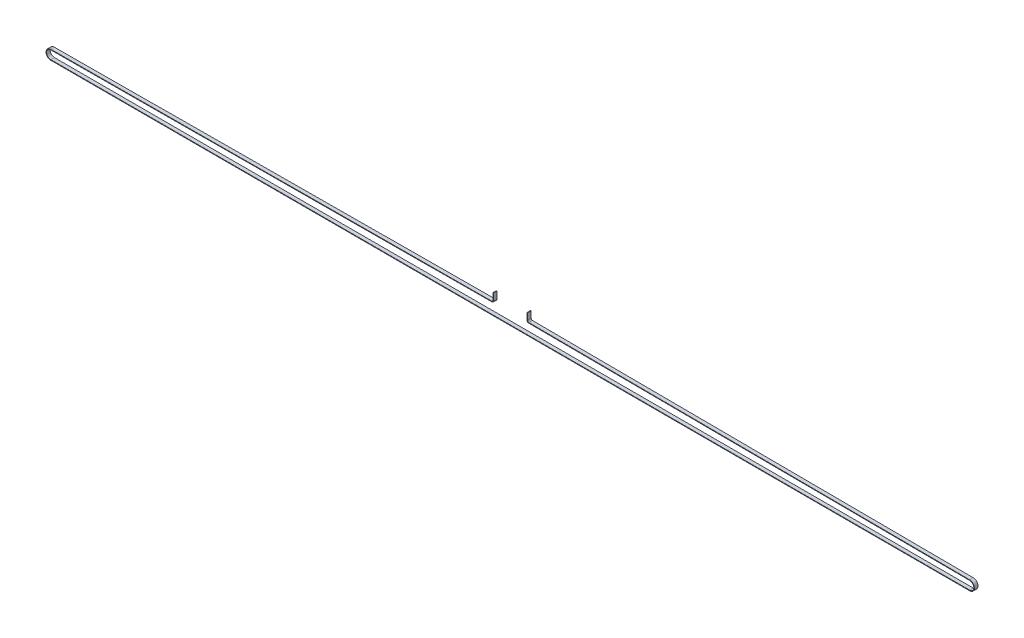
ISO-10303-21;
HEADER;
FILE_DESCRIPTION(('STEP AP214'),'2;1');
FILE_NAME('part.step','',(''),(''),'','','');
FILE_SCHEMA(('AUTOMOTIVE_DESIGN { 1 0 10303 214 1 1 1 1 }'));
ENDSEC;
DATA;
#1=APPLICATION_CONTEXT('core data for automotive mechanical design processes');
#2=APPLICATION_PROTOCOL_DEFINITION('international standard','automotive_design',2000,#1);
#3=PRODUCT_CONTEXT('',#1,'mechanical');
#4=PRODUCT('Part','Part','',(#3));
#5=PRODUCT_RELATED_PRODUCT_CATEGORY('part','',(#4));
#6=PRODUCT_DEFINITION_FORMATION('','',#4);
#7=PRODUCT_DEFINITION_CONTEXT('part definition',#1,'design');
#8=PRODUCT_DEFINITION('design','',#6,#7);
#9=PRODUCT_DEFINITION_SHAPE('','',#8);
#10=(LENGTH_UNIT() NAMED_UNIT(*) SI_UNIT(.MILLI.,.METRE.));
#11=(NAMED_UNIT(*) PLANE_ANGLE_UNIT() SI_UNIT($,.RADIAN.));
#12=(NAMED_UNIT(*) SI_UNIT($,.STERADIAN.) SOLID_ANGLE_UNIT());
#13=UNCERTAINTY_MEASURE_WITH_UNIT(LENGTH_MEASURE(1.E-05),#10,'distance_accuracy_value','');
#14=(GEOMETRIC_REPRESENTATION_CONTEXT(3) GLOBAL_UNCERTAINTY_ASSIGNED_CONTEXT((#13)) GLOBAL_UNIT_ASSIGNED_CONTEXT((#10,
#11,#12)) REPRESENTATION_CONTEXT('',''));
#15=CARTESIAN_POINT('',(0.,0.,0.));
#16=DIRECTION('',(0.,0.,1.));
#17=DIRECTION('',(1.,0.,0.));
#18=AXIS2_PLACEMENT_3D('',#15,#16,#17);
#19=CARTESIAN_POINT('',(-29.2,33.,6.56356693467296));
#20=DIRECTION('',(0.,1.,0.));
#21=DIRECTION('',(-1.,0.,0.));
#22=AXIS2_PLACEMENT_3D('',#19,#20,#21);
#23=PLANE('',#22);
#24=DIRECTION('',(0.,0.,1.));
#25=VECTOR('',#24,1.);
#26=CARTESIAN_POINT('',(-28.2,32.9999999999999,0.563566934672959));
#27=LINE('',#26,#25);
#28=CARTESIAN_POINT('',(-28.2,32.9999999999999,0.563566934672959));
#29=VERTEX_POINT('',#28);
#30=CARTESIAN_POINT('',(-28.2,32.9999999999999,6.56356693467296));
#31=VERTEX_POINT('',#30);
#32=EDGE_CURVE('E194',#29,#31,#27,.T.);
#33=ORIENTED_EDGE('',*,*,#32,.F.);
#34=DIRECTION('',(1.,0.,0.));
#35=VECTOR('',#34,1.);
#36=CARTESIAN_POINT('',(-29.2,33.,0.563566934672959));
#37=LINE('',#36,#35);
#38=CARTESIAN_POINT('',(-29.2,33.,0.563566934672959));
#39=VERTEX_POINT('',#38);
#40=EDGE_CURVE('E242',#39,#29,#37,.T.);
#41=ORIENTED_EDGE('',*,*,#40,.F.);
#42=DIRECTION('',(0.,0.,-1.));
#43=VECTOR('',#42,1.);
#44=CARTESIAN_POINT('',(-29.2,33.,6.56356693467296));
#45=LINE('',#44,#43);
#46=CARTESIAN_POINT('',(-29.2,33.,6.56356693467296));
#47=VERTEX_POINT('',#46);
#48=EDGE_CURVE('E206',#47,#39,#45,.T.);
#49=ORIENTED_EDGE('',*,*,#48,.F.);
#50=DIRECTION('',(1.,0.,0.));
#51=VECTOR('',#50,1.);
#52=CARTESIAN_POINT('',(-29.2,33.,6.56356693467296));
#53=LINE('',#52,#51);
#54=EDGE_CURVE('E182',#47,#31,#53,.T.);
#55=ORIENTED_EDGE('',*,*,#54,.T.);
#56=EDGE_LOOP('',(#33,#41,#49,#55));
#57=FACE_BOUND('',#56,.T.);
#58=ADVANCED_FACE('F39',(#57),#23,.T.);
#59=CARTESIAN_POINT('',(-29.2,20.,6.56356693467296));
#60=DIRECTION('',(-1.,0.,0.));
#61=DIRECTION('',(0.,0.,1.));
#62=AXIS2_PLACEMENT_3D('',#59,#60,#61);
#63=PLANE('',#62);
#64=DIRECTION('',(0.,1.,0.));
#65=VECTOR('',#64,1.);
#66=CARTESIAN_POINT('',(-29.2,20.,0.563566934672959));
#67=LINE('',#66,#65);
#68=CARTESIAN_POINT('',(-29.2,21.9892303321852,0.563566934672959));
#69=VERTEX_POINT('',#68);
#70=EDGE_CURVE('E237',#69,#39,#67,.T.);
#71=ORIENTED_EDGE('',*,*,#70,.F.);
#72=DIRECTION('',(0.,0.,-1.));
#73=VECTOR('',#72,1.);
#74=CARTESIAN_POINT('',(-29.2,21.9892303321852,6.56356693467296));
#75=LINE('',#74,#73);
#76=CARTESIAN_POINT('',(-29.2,21.9892303321852,6.56356693467296));
#77=VERTEX_POINT('',#76);
#78=EDGE_CURVE('E314',#69,#77,#75,.F.);
#79=ORIENTED_EDGE('',*,*,#78,.T.);
#80=DIRECTION('',(0.,1.,0.));
#81=VECTOR('',#80,1.);
#82=CARTESIAN_POINT('',(-29.2,20.,6.56356693467296));
#83=LINE('',#82,#81);
#84=EDGE_CURVE('E215',#77,#47,#83,.T.);
#85=ORIENTED_EDGE('',*,*,#84,.T.);
#86=ORIENTED_EDGE('',*,*,#48,.T.);
#87=EDGE_LOOP('',(#71,#79,#85,#86));
#88=FACE_BOUND('',#87,.T.);
#89=ADVANCED_FACE('F337',(#88),#63,.T.);
#90=CARTESIAN_POINT('',(-770.043194655313,15.9998833880096,6.56356693467296));
#91=DIRECTION('',(-0.00539933191416636,0.999985423501203,0.));
#92=DIRECTION('',(-0.999985423501203,-0.00539933191416636,0.));
#93=AXIS2_PLACEMENT_3D('',#90,#91,#92);
#94=PLANE('',#93);
#95=DIRECTION('',(0.999985423501203,0.00539933191416636,0.));
#96=VECTOR('',#95,1.);
#97=CARTESIAN_POINT('',(-770.043194655313,15.9998833880096,6.56356693467296));
#98=LINE('',#97,#96);
#99=CARTESIAN_POINT('',(-770.043194655313,15.9998833880095,6.56356693467296));
#100=VERTEX_POINT('',#99);
#101=CARTESIAN_POINT('',(-31.1892013361715,19.9892594851828,6.56356693467296));
#102=VERTEX_POINT('',#101);
#103=EDGE_CURVE('E233',#100,#102,#98,.T.);
#104=ORIENTED_EDGE('',*,*,#103,.T.);
#105=DIRECTION('',(0.,0.,-1.));
#106=VECTOR('',#105,1.);
#107=CARTESIAN_POINT('',(-31.1892013361717,19.9892594851828,0.563566934672959));
#108=LINE('',#107,#106);
#109=CARTESIAN_POINT('',(-31.1892013361715,19.9892594851828,0.563566934672959));
#110=VERTEX_POINT('',#109);
#111=EDGE_CURVE('E310',#102,#110,#108,.T.);
#112=ORIENTED_EDGE('',*,*,#111,.T.);
#113=DIRECTION('',(0.999985423501203,0.00539933191416636,0.));
#114=VECTOR('',#113,1.);
#115=CARTESIAN_POINT('',(-770.043194655313,15.9998833880096,0.563566934672959));
#116=LINE('',#115,#114);
#117=CARTESIAN_POINT('',(-770.043194655313,15.9998833880095,0.563566934672959));
#118=VERTEX_POINT('',#117);
#119=EDGE_CURVE('E264',#118,#110,#116,.T.);
#120=ORIENTED_EDGE('',*,*,#119,.F.);
#121=DIRECTION('',(0.,0.,-1.));
#122=VECTOR('',#121,1.);
#123=CARTESIAN_POINT('',(-770.043194655313,15.9998833880095,6.56356693467296));
#124=LINE('',#123,#122);
#125=EDGE_CURVE('E268',#100,#118,#124,.T.);
#126=ORIENTED_EDGE('',*,*,#125,.F.);
#127=EDGE_LOOP('',(#104,#112,#120,#126));
#128=FACE_BOUND('',#127,.T.);
#129=ADVANCED_FACE('F343',(#128),#94,.T.);
#130=CARTESIAN_POINT('',(-770.,8.,6.56356693467296));
#131=DIRECTION('',(0.,0.,-1.));
#132=DIRECTION('',(-1.,0.,0.));
#133=AXIS2_PLACEMENT_3D('',#130,#131,#132);
#134=CYLINDRICAL_SURFACE('',#133,7.99999999999986);
#135=CARTESIAN_POINT('',(-770.,8.,0.563566934672959));
#136=DIRECTION('',(0.,0.,-1.));
#137=DIRECTION('',(-1.,0.,0.));
#138=AXIS2_PLACEMENT_3D('',#135,#136,#137);
#139=CIRCLE('',#138,7.99999999999986);
#140=CARTESIAN_POINT('',(-770.,2.82738436431905E-13,0.563566934672959));
#141=VERTEX_POINT('',#140);
#142=EDGE_CURVE('E260',#141,#118,#139,.T.);
#143=ORIENTED_EDGE('',*,*,#142,.F.);
#144=DIRECTION('',(0.,0.,-1.));
#145=VECTOR('',#144,1.);
#146=CARTESIAN_POINT('',(-770.,2.82738436431905E-13,6.56356693467296));
#147=LINE('',#146,#145);
#148=CARTESIAN_POINT('',(-770.,2.82738436431905E-13,6.56356693467296));
#149=VERTEX_POINT('',#148);
#150=EDGE_CURVE('E272',#149,#141,#147,.T.);
#151=ORIENTED_EDGE('',*,*,#150,.F.);
#152=CARTESIAN_POINT('',(-770.,8.,6.56356693467296));
#153=DIRECTION('',(0.,0.,-1.));
#154=DIRECTION('',(-1.,0.,0.));
#155=AXIS2_PLACEMENT_3D('',#152,#153,#154);
#156=CIRCLE('',#155,7.99999999999986);
#157=EDGE_CURVE('E229',#149,#100,#156,.T.);
#158=ORIENTED_EDGE('',*,*,#157,.T.);
#159=ORIENTED_EDGE('',*,*,#125,.T.);
#160=EDGE_LOOP('',(#143,#151,#158,#159));
#161=FACE_BOUND('',#160,.T.);
#162=ADVANCED_FACE('F346',(#161),#134,.T.);
#163=CARTESIAN_POINT('',(770.,0.,6.56356693467296));
#164=DIRECTION('',(0.,-1.,0.));
#165=DIRECTION('',(1.,0.,0.));
#166=AXIS2_PLACEMENT_3D('',#163,#164,#165);
#167=PLANE('',#166);
#168=DIRECTION('',(-1.,0.,0.));
#169=VECTOR('',#168,1.);
#170=CARTESIAN_POINT('',(770.,0.,0.563566934672959));
#171=LINE('',#170,#169);
#172=CARTESIAN_POINT('',(770.,0.,0.563566934672959));
#173=VERTEX_POINT('',#172);
#174=EDGE_CURVE('E256',#173,#141,#171,.T.);
#175=ORIENTED_EDGE('',*,*,#174,.F.);
#176=DIRECTION('',(0.,0.,-1.));
#177=VECTOR('',#176,1.);
#178=CARTESIAN_POINT('',(770.,0.,6.56356693467296));
#179=LINE('',#178,#177);
#180=CARTESIAN_POINT('',(770.,0.,6.56356693467296));
#181=VERTEX_POINT('',#180);
#182=EDGE_CURVE('E275',#181,#173,#179,.T.);
#183=ORIENTED_EDGE('',*,*,#182,.F.);
#184=DIRECTION('',(-1.,0.,0.));
#185=VECTOR('',#184,1.);
#186=CARTESIAN_POINT('',(770.,0.,6.56356693467296));
#187=LINE('',#186,#185);
#188=EDGE_CURVE('E225',#181,#149,#187,.T.);
#189=ORIENTED_EDGE('',*,*,#188,.T.);
#190=ORIENTED_EDGE('',*,*,#150,.T.);
#191=EDGE_LOOP('',(#175,#183,#189,#190));
#192=FACE_BOUND('',#191,.T.);
#193=ADVANCED_FACE('F351',(#192),#167,.T.);
#194=CARTESIAN_POINT('',(770.,8.,6.56356693467296));
#195=DIRECTION('',(0.,0.,-1.));
#196=DIRECTION('',(-1.,0.,0.));
#197=AXIS2_PLACEMENT_3D('',#194,#195,#196);
#198=CYLINDRICAL_SURFACE('',#197,8.);
#199=CARTESIAN_POINT('',(770.,8.,0.563566934672959));
#200=DIRECTION('',(0.,0.,-1.));
#201=DIRECTION('',(-1.,0.,0.));
#202=AXIS2_PLACEMENT_3D('',#199,#200,#201);
#203=CIRCLE('',#202,8.);
#204=CARTESIAN_POINT('',(770.043194655313,15.9998833880096,0.563566934672959));
#205=VERTEX_POINT('',#204);
#206=EDGE_CURVE('E252',#205,#173,#203,.T.);
#207=ORIENTED_EDGE('',*,*,#206,.F.);
#208=DIRECTION('',(0.,0.,-1.));
#209=VECTOR('',#208,1.);
#210=CARTESIAN_POINT('',(770.043194655313,15.9998833880096,6.56356693467296));
#211=LINE('',#210,#209);
#212=CARTESIAN_POINT('',(770.043194655313,15.9998833880096,6.56356693467296));
#213=VERTEX_POINT('',#212);
#214=EDGE_CURVE('E278',#213,#205,#211,.T.);
#215=ORIENTED_EDGE('',*,*,#214,.F.);
#216=CARTESIAN_POINT('',(770.,8.,6.56356693467296));
#217=DIRECTION('',(0.,0.,-1.));
#218=DIRECTION('',(-1.,0.,0.));
#219=AXIS2_PLACEMENT_3D('',#216,#217,#218);
#220=CIRCLE('',#219,8.);
#221=EDGE_CURVE('E221',#213,#181,#220,.T.);
#222=ORIENTED_EDGE('',*,*,#221,.T.);
#223=ORIENTED_EDGE('',*,*,#182,.T.);
#224=EDGE_LOOP('',(#207,#215,#222,#223));
#225=FACE_BOUND('',#224,.T.);
#226=ADVANCED_FACE('F354',(#225),#198,.T.);
#227=CARTESIAN_POINT('',(29.2,20.,6.56356693467296));
#228=DIRECTION('',(0.00539933191416636,0.999985423501203,0.));
#229=DIRECTION('',(-0.999985423501203,0.00539933191416636,0.));
#230=AXIS2_PLACEMENT_3D('',#227,#228,#229);
#231=PLANE('',#230);
#232=DIRECTION('',(0.999985423501203,-0.00539933191416635,0.));
#233=VECTOR('',#232,1.);
#234=CARTESIAN_POINT('',(29.2,20.,0.563566934672959));
#235=LINE('',#234,#233);
#236=CARTESIAN_POINT('',(31.1892013361717,19.9892594851828,0.563566934672959));
#237=VERTEX_POINT('',#236);
#238=EDGE_CURVE('E249',#237,#205,#235,.T.);
#239=ORIENTED_EDGE('',*,*,#238,.F.);
#240=DIRECTION('',(0.,0.,-1.));
#241=VECTOR('',#240,1.);
#242=CARTESIAN_POINT('',(31.1892013361717,19.9892594851828,6.56356693467296));
#243=LINE('',#242,#241);
#244=CARTESIAN_POINT('',(31.1892013361717,19.9892594851828,6.56356693467296));
#245=VERTEX_POINT('',#244);
#246=EDGE_CURVE('E63',#237,#245,#243,.F.);
#247=ORIENTED_EDGE('',*,*,#246,.T.);
#248=DIRECTION('',(0.999985423501203,-0.00539933191416635,0.));
#249=VECTOR('',#248,1.);
#250=CARTESIAN_POINT('',(29.2,20.,6.56356693467296));
#251=LINE('',#250,#249);
#252=EDGE_CURVE('E213',#245,#213,#251,.T.);
#253=ORIENTED_EDGE('',*,*,#252,.T.);
#254=ORIENTED_EDGE('',*,*,#214,.T.);
#255=EDGE_LOOP('',(#239,#247,#253,#254));
#256=FACE_BOUND('',#255,.T.);
#257=ADVANCED_FACE('F479',(#256),#231,.T.);
#258=CARTESIAN_POINT('',(29.2,33.,6.56356693467296));
#259=DIRECTION('',(1.,0.,0.));
#260=DIRECTION('',(0.,1.,0.));
#261=AXIS2_PLACEMENT_3D('',#258,#259,#260);
#262=PLANE('',#261);
#263=DIRECTION('',(0.,-1.,0.));
#264=VECTOR('',#263,1.);
#265=CARTESIAN_POINT('',(29.2,33.,6.56356693467296));
#266=LINE('',#265,#264);
#267=CARTESIAN_POINT('',(29.2,33.,6.56356693467296));
#268=VERTEX_POINT('',#267);
#269=CARTESIAN_POINT('',(29.2,21.9892303321852,6.56356693467296));
#270=VERTEX_POINT('',#269);
#271=EDGE_CURVE('E208',#268,#270,#266,.T.);
#272=ORIENTED_EDGE('',*,*,#271,.T.);
#273=DIRECTION('',(0.,0.,-1.));
#274=VECTOR('',#273,1.);
#275=CARTESIAN_POINT('',(29.2,21.9892303321852,0.563566934672959));
#276=LINE('',#275,#274);
#277=CARTESIAN_POINT('',(29.2,21.9892303321852,0.563566934672959));
#278=VERTEX_POINT('',#277);
#279=EDGE_CURVE('E304',#270,#278,#276,.T.);
#280=ORIENTED_EDGE('',*,*,#279,.T.);
#281=DIRECTION('',(0.,-1.,0.));
#282=VECTOR('',#281,1.);
#283=CARTESIAN_POINT('',(29.2,33.,0.563566934672959));
#284=LINE('',#283,#282);
#285=CARTESIAN_POINT('',(29.2,33.,0.563566934672959));
#286=VERTEX_POINT('',#285);
#287=EDGE_CURVE('E245',#286,#278,#284,.T.);
#288=ORIENTED_EDGE('',*,*,#287,.F.);
#289=DIRECTION('',(0.,0.,-1.));
#290=VECTOR('',#289,1.);
#291=CARTESIAN_POINT('',(29.2,33.,6.56356693467296));
#292=LINE('',#291,#290);
#293=EDGE_CURVE('E282',#268,#286,#292,.T.);
#294=ORIENTED_EDGE('',*,*,#293,.F.);
#295=EDGE_LOOP('',(#272,#280,#288,#294));
#296=FACE_BOUND('',#295,.T.);
#297=ADVANCED_FACE('F361',(#296),#262,.T.);
#298=DIRECTION('',(0.,0.,-1.));
#299=VECTOR('',#298,1.);
#300=CARTESIAN_POINT('',(28.2,33.0000000000001,6.56356693467296));
#301=LINE('',#300,#299);
#302=CARTESIAN_POINT('',(28.2,33.0000000000001,6.56356693467296));
#303=VERTEX_POINT('',#302);
#304=CARTESIAN_POINT('',(28.2,33.0000000000001,0.563566934672959));
#305=VERTEX_POINT('',#304);
#306=EDGE_CURVE('E202',#303,#305,#301,.T.);
#307=ORIENTED_EDGE('',*,*,#306,.F.);
#308=EDGE_CURVE('E209',#303,#268,#53,.T.);
#309=ORIENTED_EDGE('',*,*,#308,.T.);
#310=ORIENTED_EDGE('',*,*,#293,.T.);
#311=EDGE_CURVE('E240',#305,#286,#37,.T.);
#312=ORIENTED_EDGE('',*,*,#311,.F.);
#313=EDGE_LOOP('',(#307,#309,#310,#312));
#314=FACE_BOUND('',#313,.T.);
#315=ADVANCED_FACE('F370',(#314),#23,.T.);
#316=CARTESIAN_POINT('',(770.,8.,6.56356693467296));
#317=DIRECTION('',(0.,0.,-1.));
#318=DIRECTION('',(-1.,0.,0.));
#319=AXIS2_PLACEMENT_3D('',#316,#317,#318);
#320=PLANE('',#319);
#321=DIRECTION('',(0.,1.,0.));
#322=VECTOR('',#321,1.);
#323=CARTESIAN_POINT('',(-28.2,19.0053848339074,6.56356693467296));
#324=LINE('',#323,#322);
#325=CARTESIAN_POINT('',(-28.2,20.9946151660926,6.56356693467296));
#326=VERTEX_POINT('',#325);
#327=EDGE_CURVE('E177',#326,#31,#324,.T.);
#328=ORIENTED_EDGE('',*,*,#327,.T.);
#329=ORIENTED_EDGE('',*,*,#54,.F.);
#330=ORIENTED_EDGE('',*,*,#84,.F.);
#331=CARTESIAN_POINT('',(-31.2,21.9892303321852,6.56356693467296));
#332=DIRECTION('',(0.,0.,-1.));
#333=DIRECTION('',(-1.,0.,0.));
#334=AXIS2_PLACEMENT_3D('',#331,#332,#333);
#335=CIRCLE('',#334,2.);
#336=EDGE_CURVE('E11',#77,#102,#335,.T.);
#337=ORIENTED_EDGE('',*,*,#336,.T.);
#338=ORIENTED_EDGE('',*,*,#103,.F.);
#339=ORIENTED_EDGE('',*,*,#157,.F.);
#340=ORIENTED_EDGE('',*,*,#188,.F.);
#341=ORIENTED_EDGE('',*,*,#221,.F.);
#342=ORIENTED_EDGE('',*,*,#252,.F.);
#343=CARTESIAN_POINT('',(31.2,21.9892303321852,6.56356693467296));
#344=DIRECTION('',(0.,0.,-1.));
#345=DIRECTION('',(-1.,0.,0.));
#346=AXIS2_PLACEMENT_3D('',#343,#344,#345);
#347=CIRCLE('',#346,2.);
#348=EDGE_CURVE('E55',#245,#270,#347,.T.);
#349=ORIENTED_EDGE('',*,*,#348,.T.);
#350=ORIENTED_EDGE('',*,*,#271,.F.);
#351=ORIENTED_EDGE('',*,*,#308,.F.);
#352=DIRECTION('',(0.,-1.,0.));
#353=VECTOR('',#352,1.);
#354=CARTESIAN_POINT('',(28.2,32.,6.56356693467296));
#355=LINE('',#354,#353);
#356=CARTESIAN_POINT('',(28.2,20.9946151660926,6.56356693467296));
#357=VERTEX_POINT('',#356);
#358=EDGE_CURVE('E190',#303,#357,#355,.T.);
#359=ORIENTED_EDGE('',*,*,#358,.T.);
#360=CARTESIAN_POINT('',(30.2,20.9946151660926,6.56356693467296));
#361=DIRECTION('',(0.,0.,-1.));
#362=DIRECTION('',(-1.,0.,0.));
#363=AXIS2_PLACEMENT_3D('',#360,#361,#362);
#364=CIRCLE('',#363,2.);
#365=CARTESIAN_POINT('',(30.1892013361717,18.9946443190902,6.56356693467296));
#366=VERTEX_POINT('',#365);
#367=EDGE_CURVE('E299',#357,#366,#364,.F.);
#368=ORIENTED_EDGE('',*,*,#367,.T.);
#369=DIRECTION('',(0.999985423501203,-0.00539933191416636,0.));
#370=VECTOR('',#369,1.);
#371=CARTESIAN_POINT('',(28.2,19.0053848339074,6.56356693467296));
#372=LINE('',#371,#370);
#373=CARTESIAN_POINT('',(770.037795323399,14.9998979645084,6.56356693467296));
#374=VERTEX_POINT('',#373);
#375=EDGE_CURVE('E377',#366,#374,#372,.T.);
#376=ORIENTED_EDGE('',*,*,#375,.T.);
#377=CARTESIAN_POINT('',(770.,8.,6.56356693467296));
#378=DIRECTION('',(0.,0.,-1.));
#379=DIRECTION('',(-1.,0.,0.));
#380=AXIS2_PLACEMENT_3D('',#377,#378,#379);
#381=CIRCLE('',#380,7.);
#382=CARTESIAN_POINT('',(770.,1.,6.56356693467296));
#383=VERTEX_POINT('',#382);
#384=EDGE_CURVE('E427',#374,#383,#381,.T.);
#385=ORIENTED_EDGE('',*,*,#384,.T.);
#386=DIRECTION('',(-1.,0.,0.));
#387=VECTOR('',#386,1.);
#388=CARTESIAN_POINT('',(770.,1.,6.56356693467296));
#389=LINE('',#388,#387);
#390=CARTESIAN_POINT('',(-770.,1.00000000000028,6.56356693467296));
#391=VERTEX_POINT('',#390);
#392=EDGE_CURVE('E422',#383,#391,#389,.T.);
#393=ORIENTED_EDGE('',*,*,#392,.T.);
#394=CARTESIAN_POINT('',(-770.,8.,6.56356693467296));
#395=DIRECTION('',(0.,0.,-1.));
#396=DIRECTION('',(-1.,0.,0.));
#397=AXIS2_PLACEMENT_3D('',#394,#395,#396);
#398=CIRCLE('',#397,6.99999999999975);
#399=CARTESIAN_POINT('',(-770.037795323399,14.9998979645082,6.56356693467296));
#400=VERTEX_POINT('',#399);
#401=EDGE_CURVE('E417',#391,#400,#398,.T.);
#402=ORIENTED_EDGE('',*,*,#401,.T.);
#403=DIRECTION('',(0.999985423501203,0.00539933191416664,0.));
#404=VECTOR('',#403,1.);
#405=CARTESIAN_POINT('',(-770.037795323399,14.9998979645082,6.56356693467296));
#406=LINE('',#405,#404);
#407=CARTESIAN_POINT('',(-30.1892013361715,18.9946443190902,6.56356693467296));
#408=VERTEX_POINT('',#407);
#409=EDGE_CURVE('E191',#400,#408,#406,.T.);
#410=ORIENTED_EDGE('',*,*,#409,.T.);
#411=CARTESIAN_POINT('',(-30.2,20.9946151660926,6.56356693467296));
#412=DIRECTION('',(0.,0.,-1.));
#413=DIRECTION('',(-1.,0.,0.));
#414=AXIS2_PLACEMENT_3D('',#411,#412,#413);
#415=CIRCLE('',#414,2.);
#416=EDGE_CURVE('E185',#408,#326,#415,.F.);
#417=ORIENTED_EDGE('',*,*,#416,.T.);
#418=EDGE_LOOP('',(#328,#329,#330,#337,#338,#339,#340,#341,#342,#349,#350,#351,#359,#368,#376,
#385,#393,#402,#410,#417));
#419=FACE_BOUND('',#418,.T.);
#420=ADVANCED_FACE('F179',(#419),#320,.F.);
#421=CARTESIAN_POINT('',(770.,8.,0.563566934672959));
#422=DIRECTION('',(0.,0.,-1.));
#423=DIRECTION('',(-1.,0.,0.));
#424=AXIS2_PLACEMENT_3D('',#421,#422,#423);
#425=PLANE('',#424);
#426=ORIENTED_EDGE('',*,*,#40,.T.);
#427=DIRECTION('',(0.,1.,0.));
#428=VECTOR('',#427,1.);
#429=CARTESIAN_POINT('',(-28.2,19.0053848339074,0.563566934672959));
#430=LINE('',#429,#428);
#431=CARTESIAN_POINT('',(-28.2,20.9946151660926,0.563566934672959));
#432=VERTEX_POINT('',#431);
#433=EDGE_CURVE('E197',#432,#29,#430,.T.);
#434=ORIENTED_EDGE('',*,*,#433,.F.);
#435=CARTESIAN_POINT('',(-30.2,20.9946151660926,0.563566934672959));
#436=DIRECTION('',(0.,0.,-1.));
#437=DIRECTION('',(-1.,0.,0.));
#438=AXIS2_PLACEMENT_3D('',#435,#436,#437);
#439=CIRCLE('',#438,2.);
#440=CARTESIAN_POINT('',(-30.1892013361715,18.9946443190902,0.563566934672959));
#441=VERTEX_POINT('',#440);
#442=EDGE_CURVE('E293',#432,#441,#439,.T.);
#443=ORIENTED_EDGE('',*,*,#442,.T.);
#444=DIRECTION('',(0.999985423501203,0.00539933191416664,0.));
#445=VECTOR('',#444,1.);
#446=CARTESIAN_POINT('',(-770.037795323399,14.9998979645082,0.563566934672959));
#447=LINE('',#446,#445);
#448=CARTESIAN_POINT('',(-770.037795323399,14.9998979645082,0.563566934672959));
#449=VERTEX_POINT('',#448);
#450=EDGE_CURVE('E431',#449,#441,#447,.T.);
#451=ORIENTED_EDGE('',*,*,#450,.F.);
#452=CARTESIAN_POINT('',(-770.,8.,0.563566934672959));
#453=DIRECTION('',(0.,0.,-1.));
#454=DIRECTION('',(-1.,0.,0.));
#455=AXIS2_PLACEMENT_3D('',#452,#453,#454);
#456=CIRCLE('',#455,6.99999999999975);
#457=CARTESIAN_POINT('',(-770.,1.00000000000028,0.563566934672959));
#458=VERTEX_POINT('',#457);
#459=EDGE_CURVE('E404',#458,#449,#456,.T.);
#460=ORIENTED_EDGE('',*,*,#459,.F.);
#461=DIRECTION('',(-1.,0.,0.));
#462=VECTOR('',#461,1.);
#463=CARTESIAN_POINT('',(770.,1.,0.563566934672959));
#464=LINE('',#463,#462);
#465=CARTESIAN_POINT('',(770.,1.,0.563566934672959));
#466=VERTEX_POINT('',#465);
#467=EDGE_CURVE('E396',#466,#458,#464,.T.);
#468=ORIENTED_EDGE('',*,*,#467,.F.);
#469=CARTESIAN_POINT('',(770.,8.,0.563566934672959));
#470=DIRECTION('',(0.,0.,-1.));
#471=DIRECTION('',(-1.,0.,0.));
#472=AXIS2_PLACEMENT_3D('',#469,#470,#471);
#473=CIRCLE('',#472,7.);
#474=CARTESIAN_POINT('',(770.037795323399,14.9998979645084,0.563566934672959));
#475=VERTEX_POINT('',#474);
#476=EDGE_CURVE('E391',#475,#466,#473,.T.);
#477=ORIENTED_EDGE('',*,*,#476,.F.);
#478=DIRECTION('',(0.999985423501203,-0.00539933191416636,0.));
#479=VECTOR('',#478,1.);
#480=CARTESIAN_POINT('',(28.2,19.0053848339074,0.563566934672959));
#481=LINE('',#480,#479);
#482=CARTESIAN_POINT('',(30.1892013361717,18.9946443190902,0.563566934672959));
#483=VERTEX_POINT('',#482);
#484=EDGE_CURVE('E386',#483,#475,#481,.T.);
#485=ORIENTED_EDGE('',*,*,#484,.F.);
#486=CARTESIAN_POINT('',(30.2,20.9946151660926,0.563566934672959));
#487=DIRECTION('',(0.,0.,-1.));
#488=DIRECTION('',(-1.,0.,0.));
#489=AXIS2_PLACEMENT_3D('',#486,#487,#488);
#490=CIRCLE('',#489,2.);
#491=CARTESIAN_POINT('',(28.2,20.9946151660926,0.563566934672959));
#492=VERTEX_POINT('',#491);
#493=EDGE_CURVE('E290',#483,#492,#490,.T.);
#494=ORIENTED_EDGE('',*,*,#493,.T.);
#495=DIRECTION('',(0.,-1.,0.));
#496=VECTOR('',#495,1.);
#497=CARTESIAN_POINT('',(28.2,32.,0.563566934672959));
#498=LINE('',#497,#496);
#499=EDGE_CURVE('E365',#305,#492,#498,.T.);
#500=ORIENTED_EDGE('',*,*,#499,.F.);
#501=ORIENTED_EDGE('',*,*,#311,.T.);
#502=ORIENTED_EDGE('',*,*,#287,.T.);
#503=CARTESIAN_POINT('',(31.2,21.9892303321852,0.563566934672959));
#504=DIRECTION('',(0.,0.,-1.));
#505=DIRECTION('',(-1.,0.,0.));
#506=AXIS2_PLACEMENT_3D('',#503,#504,#505);
#507=CIRCLE('',#506,2.);
#508=EDGE_CURVE('E324',#278,#237,#507,.F.);
#509=ORIENTED_EDGE('',*,*,#508,.T.);
#510=ORIENTED_EDGE('',*,*,#238,.T.);
#511=ORIENTED_EDGE('',*,*,#206,.T.);
#512=ORIENTED_EDGE('',*,*,#174,.T.);
#513=ORIENTED_EDGE('',*,*,#142,.T.);
#514=ORIENTED_EDGE('',*,*,#119,.T.);
#515=CARTESIAN_POINT('',(-31.2,21.9892303321852,0.563566934672959));
#516=DIRECTION('',(0.,0.,-1.));
#517=DIRECTION('',(-1.,0.,0.));
#518=AXIS2_PLACEMENT_3D('',#515,#516,#517);
#519=CIRCLE('',#518,2.);
#520=EDGE_CURVE('E48',#110,#69,#519,.F.);
#521=ORIENTED_EDGE('',*,*,#520,.T.);
#522=ORIENTED_EDGE('',*,*,#70,.T.);
#523=EDGE_LOOP('',(#426,#434,#443,#451,#460,#468,#477,#485,#494,#500,#501,#502,#509,#510,#511,
#512,#513,#514,#521,#522));
#524=FACE_BOUND('',#523,.T.);
#525=ADVANCED_FACE('F331',(#524),#425,.T.);
#526=CARTESIAN_POINT('',(-770.037795323399,14.9998979645082,6.56356693467296));
#527=DIRECTION('',(-0.00539933191416664,0.999985423501203,0.));
#528=DIRECTION('',(-0.999985423501203,-0.00539933191416664,0.));
#529=AXIS2_PLACEMENT_3D('',#526,#527,#528);
#530=PLANE('',#529);
#531=ORIENTED_EDGE('',*,*,#450,.T.);
#532=DIRECTION('',(0.,0.,-1.));
#533=VECTOR('',#532,1.);
#534=CARTESIAN_POINT('',(-30.1892013361718,18.9946443190902,6.56356693467296));
#535=LINE('',#534,#533);
#536=EDGE_CURVE('E296',#441,#408,#535,.F.);
#537=ORIENTED_EDGE('',*,*,#536,.T.);
#538=ORIENTED_EDGE('',*,*,#409,.F.);
#539=DIRECTION('',(0.,0.,-1.));
#540=VECTOR('',#539,1.);
#541=CARTESIAN_POINT('',(-770.037795323399,14.9998979645082,6.56356693467296));
#542=LINE('',#541,#540);
#543=EDGE_CURVE('E241',#400,#449,#542,.T.);
#544=ORIENTED_EDGE('',*,*,#543,.T.);
#545=EDGE_LOOP('',(#531,#537,#538,#544));
#546=FACE_BOUND('',#545,.T.);
#547=ADVANCED_FACE('F453',(#546),#530,.F.);
#548=CARTESIAN_POINT('',(-770.,8.,6.56356693467296));
#549=DIRECTION('',(0.,0.,-1.));
#550=DIRECTION('',(-1.,0.,0.));
#551=AXIS2_PLACEMENT_3D('',#548,#549,#550);
#552=CYLINDRICAL_SURFACE('',#551,6.99999999999975);
#553=ORIENTED_EDGE('',*,*,#459,.T.);
#554=ORIENTED_EDGE('',*,*,#543,.F.);
#555=ORIENTED_EDGE('',*,*,#401,.F.);
#556=DIRECTION('',(0.,0.,-1.));
#557=VECTOR('',#556,1.);
#558=CARTESIAN_POINT('',(-770.,1.00000000000028,6.56356693467296));
#559=LINE('',#558,#557);
#560=EDGE_CURVE('E410',#391,#458,#559,.T.);
#561=ORIENTED_EDGE('',*,*,#560,.T.);
#562=EDGE_LOOP('',(#553,#554,#555,#561));
#563=FACE_BOUND('',#562,.T.);
#564=ADVANCED_FACE('F449',(#563),#552,.F.);
#565=CARTESIAN_POINT('',(770.,1.,6.56356693467296));
#566=DIRECTION('',(0.,-1.,0.));
#567=DIRECTION('',(1.,0.,0.));
#568=AXIS2_PLACEMENT_3D('',#565,#566,#567);
#569=PLANE('',#568);
#570=ORIENTED_EDGE('',*,*,#467,.T.);
#571=ORIENTED_EDGE('',*,*,#560,.F.);
#572=ORIENTED_EDGE('',*,*,#392,.F.);
#573=DIRECTION('',(0.,0.,-1.));
#574=VECTOR('',#573,1.);
#575=CARTESIAN_POINT('',(770.,1.,6.56356693467296));
#576=LINE('',#575,#574);
#577=EDGE_CURVE('E413',#383,#466,#576,.T.);
#578=ORIENTED_EDGE('',*,*,#577,.T.);
#579=EDGE_LOOP('',(#570,#571,#572,#578));
#580=FACE_BOUND('',#579,.T.);
#581=ADVANCED_FACE('F446',(#580),#569,.F.);
#582=CARTESIAN_POINT('',(770.,8.,6.56356693467296));
#583=DIRECTION('',(0.,0.,-1.));
#584=DIRECTION('',(-1.,0.,0.));
#585=AXIS2_PLACEMENT_3D('',#582,#583,#584);
#586=CYLINDRICAL_SURFACE('',#585,7.);
#587=ORIENTED_EDGE('',*,*,#476,.T.);
#588=ORIENTED_EDGE('',*,*,#577,.F.);
#589=ORIENTED_EDGE('',*,*,#384,.F.);
#590=DIRECTION('',(0.,0.,-1.));
#591=VECTOR('',#590,1.);
#592=CARTESIAN_POINT('',(770.037795323399,14.9998979645084,6.56356693467296));
#593=LINE('',#592,#591);
#594=EDGE_CURVE('E415',#374,#475,#593,.T.);
#595=ORIENTED_EDGE('',*,*,#594,.T.);
#596=EDGE_LOOP('',(#587,#588,#589,#595));
#597=FACE_BOUND('',#596,.T.);
#598=ADVANCED_FACE('F444',(#597),#586,.F.);
#599=CARTESIAN_POINT('',(28.2,19.0053848339074,6.56356693467296));
#600=DIRECTION('',(0.00539933191416635,0.999985423501203,0.));
#601=DIRECTION('',(-0.999985423501203,0.00539933191416635,0.));
#602=AXIS2_PLACEMENT_3D('',#599,#600,#601);
#603=PLANE('',#602);
#604=ORIENTED_EDGE('',*,*,#375,.F.);
#605=DIRECTION('',(0.,0.,-1.));
#606=VECTOR('',#605,1.);
#607=CARTESIAN_POINT('',(30.1892013361717,18.9946443190902,6.56356693467296));
#608=LINE('',#607,#606);
#609=EDGE_CURVE('E317',#366,#483,#608,.T.);
#610=ORIENTED_EDGE('',*,*,#609,.T.);
#611=ORIENTED_EDGE('',*,*,#484,.T.);
#612=ORIENTED_EDGE('',*,*,#594,.F.);
#613=EDGE_LOOP('',(#604,#610,#611,#612));
#614=FACE_BOUND('',#613,.T.);
#615=ADVANCED_FACE('F384',(#614),#603,.F.);
#616=CARTESIAN_POINT('',(28.2,32.,6.56356693467296));
#617=DIRECTION('',(1.,0.,0.));
#618=DIRECTION('',(0.,1.,0.));
#619=AXIS2_PLACEMENT_3D('',#616,#617,#618);
#620=PLANE('',#619);
#621=ORIENTED_EDGE('',*,*,#499,.T.);
#622=DIRECTION('',(0.,0.,-1.));
#623=VECTOR('',#622,1.);
#624=CARTESIAN_POINT('',(28.2,20.9946151660926,6.56356693467296));
#625=LINE('',#624,#623);
#626=EDGE_CURVE('E321',#492,#357,#625,.F.);
#627=ORIENTED_EDGE('',*,*,#626,.T.);
#628=ORIENTED_EDGE('',*,*,#358,.F.);
#629=ORIENTED_EDGE('',*,*,#306,.T.);
#630=EDGE_LOOP('',(#621,#627,#628,#629));
#631=FACE_BOUND('',#630,.T.);
#632=ADVANCED_FACE('F464',(#631),#620,.F.);
#633=CARTESIAN_POINT('',(-28.2,19.0053848339074,6.56356693467296));
#634=DIRECTION('',(-1.,0.,0.));
#635=DIRECTION('',(0.,0.,1.));
#636=AXIS2_PLACEMENT_3D('',#633,#634,#635);
#637=PLANE('',#636);
#638=ORIENTED_EDGE('',*,*,#327,.F.);
#639=DIRECTION('',(0.,0.,-1.));
#640=VECTOR('',#639,1.);
#641=CARTESIAN_POINT('',(-28.2,20.9946151660926,6.56356693467296));
#642=LINE('',#641,#640);
#643=EDGE_CURVE('E271',#326,#432,#642,.T.);
#644=ORIENTED_EDGE('',*,*,#643,.T.);
#645=ORIENTED_EDGE('',*,*,#433,.T.);
#646=ORIENTED_EDGE('',*,*,#32,.T.);
#647=EDGE_LOOP('',(#638,#644,#645,#646));
#648=FACE_BOUND('',#647,.T.);
#649=ADVANCED_FACE('F195',(#648),#637,.F.);
#650=CARTESIAN_POINT('',(-30.2,20.9946151660926,6.56356693467296));
#651=DIRECTION('',(0.,0.,-1.));
#652=DIRECTION('',(-1.,0.,0.));
#653=AXIS2_PLACEMENT_3D('',#650,#651,#652);
#654=CYLINDRICAL_SURFACE('',#653,2.);
#655=ORIENTED_EDGE('',*,*,#416,.F.);
#656=ORIENTED_EDGE('',*,*,#536,.F.);
#657=ORIENTED_EDGE('',*,*,#442,.F.);
#658=ORIENTED_EDGE('',*,*,#643,.F.);
#659=EDGE_LOOP('',(#655,#656,#657,#658));
#660=FACE_BOUND('',#659,.T.);
#661=ADVANCED_FACE('F456',(#660),#654,.T.);
#662=CARTESIAN_POINT('',(31.2,21.9892303321852,6.56356693467296));
#663=DIRECTION('',(0.,0.,1.));
#664=DIRECTION('',(1.,0.,0.));
#665=AXIS2_PLACEMENT_3D('',#662,#663,#664);
#666=CYLINDRICAL_SURFACE('',#665,2.);
#667=ORIENTED_EDGE('',*,*,#348,.F.);
#668=ORIENTED_EDGE('',*,*,#246,.F.);
#669=ORIENTED_EDGE('',*,*,#508,.F.);
#670=ORIENTED_EDGE('',*,*,#279,.F.);
#671=EDGE_LOOP('',(#667,#668,#669,#670));
#672=FACE_BOUND('',#671,.T.);
#673=ADVANCED_FACE('F358',(#672),#666,.F.);
#674=CARTESIAN_POINT('',(-31.2,21.9892303321852,6.56356693467296));
#675=DIRECTION('',(0.,0.,1.));
#676=DIRECTION('',(1.,0.,0.));
#677=AXIS2_PLACEMENT_3D('',#674,#675,#676);
#678=CYLINDRICAL_SURFACE('',#677,2.);
#679=ORIENTED_EDGE('',*,*,#336,.F.);
#680=ORIENTED_EDGE('',*,*,#78,.F.);
#681=ORIENTED_EDGE('',*,*,#520,.F.);
#682=ORIENTED_EDGE('',*,*,#111,.F.);
#683=EDGE_LOOP('',(#679,#680,#681,#682));
#684=FACE_BOUND('',#683,.T.);
#685=ADVANCED_FACE('F339',(#684),#678,.F.);
#686=CARTESIAN_POINT('',(30.2,20.9946151660926,6.56356693467296));
#687=DIRECTION('',(0.,0.,-1.));
#688=DIRECTION('',(-1.,0.,0.));
#689=AXIS2_PLACEMENT_3D('',#686,#687,#688);
#690=CYLINDRICAL_SURFACE('',#689,2.);
#691=ORIENTED_EDGE('',*,*,#367,.F.);
#692=ORIENTED_EDGE('',*,*,#626,.F.);
#693=ORIENTED_EDGE('',*,*,#493,.F.);
#694=ORIENTED_EDGE('',*,*,#609,.F.);
#695=EDGE_LOOP('',(#691,#692,#693,#694));
#696=FACE_BOUND('',#695,.T.);
#697=ADVANCED_FACE('F41',(#696),#690,.T.);
#698=CLOSED_SHELL('',(#58,#89,#129,#162,#193,#226,#257,#297,#315,#420,#525,#547,#564,#581,#598,
#615,#632,#649,#661,#673,#685,#697));
#699=MANIFOLD_SOLID_BREP('B2',#698);
#700=ADVANCED_BREP_SHAPE_REPRESENTATION('',(#18,#699),#14);
#701=SHAPE_DEFINITION_REPRESENTATION(#9,#700);
ENDSEC;
END-ISO-10303-21;
